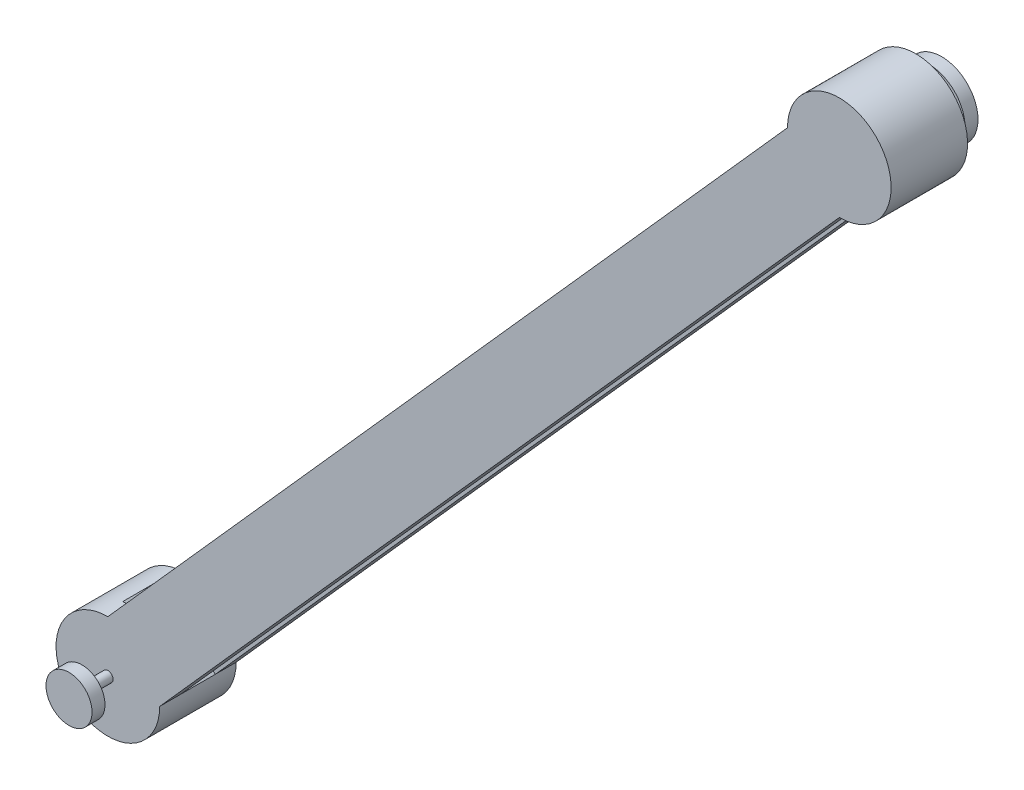
ISO-10303-21;
HEADER;
FILE_DESCRIPTION(('STEP AP214'),'2;1');
FILE_NAME('part.step','',(''),(''),'','','');
FILE_SCHEMA(('AUTOMOTIVE_DESIGN { 1 0 10303 214 1 1 1 1 }'));
ENDSEC;
DATA;
#1=APPLICATION_CONTEXT('core data for automotive mechanical design processes');
#2=APPLICATION_PROTOCOL_DEFINITION('international standard','automotive_design',2000,#1);
#3=PRODUCT_CONTEXT('',#1,'mechanical');
#4=PRODUCT('Part','Part','',(#3));
#5=PRODUCT_RELATED_PRODUCT_CATEGORY('part','',(#4));
#6=PRODUCT_DEFINITION_FORMATION('','',#4);
#7=PRODUCT_DEFINITION_CONTEXT('part definition',#1,'design');
#8=PRODUCT_DEFINITION('design','',#6,#7);
#9=PRODUCT_DEFINITION_SHAPE('','',#8);
#10=(LENGTH_UNIT() NAMED_UNIT(*) SI_UNIT(.MILLI.,.METRE.));
#11=(NAMED_UNIT(*) PLANE_ANGLE_UNIT() SI_UNIT($,.RADIAN.));
#12=(NAMED_UNIT(*) SI_UNIT($,.STERADIAN.) SOLID_ANGLE_UNIT());
#13=UNCERTAINTY_MEASURE_WITH_UNIT(LENGTH_MEASURE(1.E-05),#10,'distance_accuracy_value','');
#14=(GEOMETRIC_REPRESENTATION_CONTEXT(3) GLOBAL_UNCERTAINTY_ASSIGNED_CONTEXT((#13)) GLOBAL_UNIT_ASSIGNED_CONTEXT((#10,
#11,#12)) REPRESENTATION_CONTEXT('',''));
#15=CARTESIAN_POINT('',(0.,0.,0.));
#16=DIRECTION('',(0.,0.,1.));
#17=DIRECTION('',(1.,0.,0.));
#18=AXIS2_PLACEMENT_3D('',#15,#16,#17);
#19=CARTESIAN_POINT('',(157.094667176037,-48.9305085245538,-336.656253530233));
#20=DIRECTION('',(0.,0.,1.));
#21=DIRECTION('',(-1.,0.,0.));
#22=AXIS2_PLACEMENT_3D('',#19,#20,#21);
#23=CYLINDRICAL_SURFACE('',#22,7.12698067990463);
#24=CARTESIAN_POINT('',(157.094667176037,-48.9305085245538,-336.656253530233));
#25=DIRECTION('',(0.,0.,1.));
#26=DIRECTION('',(1.,0.,0.));
#27=AXIS2_PLACEMENT_3D('',#24,#25,#26);
#28=CIRCLE('',#27,7.12698067990463);
#29=CARTESIAN_POINT('',(164.221647855942,-48.9305085245538,-336.656253530233));
#30=VERTEX_POINT('',#29);
#31=EDGE_CURVE('E11',#30,#30,#28,.T.);
#32=ORIENTED_EDGE('',*,*,#31,.T.);
#33=EDGE_LOOP('',(#32));
#34=FACE_BOUND('',#33,.T.);
#35=CARTESIAN_POINT('',(157.094667176037,-48.9305085245538,-334.116253530233));
#36=DIRECTION('',(0.,0.,1.));
#37=DIRECTION('',(1.,0.,0.));
#38=AXIS2_PLACEMENT_3D('',#35,#36,#37);
#39=CIRCLE('',#38,7.12698067990463);
#40=CARTESIAN_POINT('',(164.221647855942,-48.9305085245538,-334.116253530233));
#41=VERTEX_POINT('',#40);
#42=EDGE_CURVE('E46',#41,#41,#39,.T.);
#43=ORIENTED_EDGE('',*,*,#42,.F.);
#44=EDGE_LOOP('',(#43));
#45=FACE_BOUND('',#44,.T.);
#46=ADVANCED_FACE('F43',(#34,#45),#23,.T.);
#47=CARTESIAN_POINT('',(157.094667176037,-48.9305085245538,-336.656253530233));
#48=DIRECTION('',(0.,0.,-1.));
#49=DIRECTION('',(1.,0.,0.));
#50=AXIS2_PLACEMENT_3D('',#47,#48,#49);
#51=PLANE('',#50);
#52=ORIENTED_EDGE('',*,*,#31,.F.);
#53=EDGE_LOOP('',(#52));
#54=FACE_BOUND('',#53,.T.);
#55=ADVANCED_FACE('F246',(#54),#51,.T.);
#56=CARTESIAN_POINT('',(157.094667176037,-48.9305085245538,-334.116253530233));
#57=DIRECTION('',(0.,0.,-1.));
#58=DIRECTION('',(1.,0.,0.));
#59=AXIS2_PLACEMENT_3D('',#56,#57,#58);
#60=PLANE('',#59);
#61=CARTESIAN_POINT('',(157.094667176037,-48.9305085245538,-334.116253530233));
#62=DIRECTION('',(0.,0.,1.));
#63=DIRECTION('',(1.,0.,0.));
#64=AXIS2_PLACEMENT_3D('',#61,#62,#63);
#65=CIRCLE('',#64,1.016);
#66=CARTESIAN_POINT('',(158.110667176037,-48.9305085245538,-334.116253530233));
#67=VERTEX_POINT('',#66);
#68=EDGE_CURVE('E412',#67,#67,#65,.T.);
#69=ORIENTED_EDGE('',*,*,#68,.F.);
#70=EDGE_LOOP('',(#69));
#71=FACE_BOUND('',#70,.T.);
#72=ORIENTED_EDGE('',*,*,#42,.T.);
#73=EDGE_LOOP('',(#72));
#74=FACE_BOUND('',#73,.T.);
#75=ADVANCED_FACE('F251',(#71,#74),#60,.F.);
#76=CARTESIAN_POINT('',(116.967044027861,-104.154446141889,-316.590253530233));
#77=DIRECTION('',(0.746826492090616,-0.66501894011496,0.));
#78=DIRECTION('',(0.66501894011496,0.746826492090616,0.));
#79=AXIS2_PLACEMENT_3D('',#76,#77,#78);
#80=PLANE('',#79);
#81=DIRECTION('',(0.66501894011496,0.746826492090616,0.));
#82=VECTOR('',#81,1.);
#83=CARTESIAN_POINT('',(157.094667176037,-59.0905085245538,-320.672765338957));
#84=LINE('',#83,#82);
#85=CARTESIAN_POINT('',(23.8515333224159,-208.724595989579,-320.672765338957));
#86=VERTEX_POINT('',#85);
#87=CARTESIAN_POINT('',(157.094667176037,-59.0905085245538,-320.672765338957));
#88=VERTEX_POINT('',#87);
#89=EDGE_CURVE('E132',#86,#88,#84,.T.);
#90=ORIENTED_EDGE('',*,*,#89,.T.);
#91=DIRECTION('',(0.,0.,-1.));
#92=VECTOR('',#91,1.);
#93=CARTESIAN_POINT('',(157.094667176037,-59.0905085245538,-316.590253530233));
#94=LINE('',#93,#92);
#95=CARTESIAN_POINT('',(157.094667176037,-59.0905085245538,-316.590253530233));
#96=VERTEX_POINT('',#95);
#97=EDGE_CURVE('E129',#96,#88,#94,.T.);
#98=ORIENTED_EDGE('',*,*,#97,.F.);
#99=DIRECTION('',(0.66501894011496,0.746826492090616,0.));
#100=VECTOR('',#99,1.);
#101=CARTESIAN_POINT('',(116.967044027861,-104.154446141889,-316.590253530233));
#102=LINE('',#101,#100);
#103=CARTESIAN_POINT('',(23.8515333224159,-208.724595989579,-316.590253530233));
#104=VERTEX_POINT('',#103);
#105=EDGE_CURVE('E174',#104,#96,#102,.T.);
#106=ORIENTED_EDGE('',*,*,#105,.F.);
#107=DIRECTION('',(0.,0.,-1.));
#108=VECTOR('',#107,1.);
#109=CARTESIAN_POINT('',(23.8515333224159,-208.724595989579,-316.590253530233));
#110=LINE('',#109,#108);
#111=EDGE_CURVE('E183',#104,#86,#110,.T.);
#112=ORIENTED_EDGE('',*,*,#111,.T.);
#113=EDGE_LOOP('',(#90,#98,#106,#112));
#114=FACE_BOUND('',#113,.T.);
#115=ADVANCED_FACE('F215',(#114),#80,.T.);
#116=DIRECTION('',(-0.66501894011496,-0.746826492090616,0.));
#117=VECTOR('',#116,1.);
#118=CARTESIAN_POINT('',(157.094667176037,-59.0905085245538,-327.493741721509));
#119=LINE('',#118,#117);
#120=CARTESIAN_POINT('',(157.094667176037,-59.0905085245538,-327.493741721509));
#121=VERTEX_POINT('',#120);
#122=CARTESIAN_POINT('',(23.8515333224159,-208.724595989579,-327.493741721509));
#123=VERTEX_POINT('',#122);
#124=EDGE_CURVE('E131',#121,#123,#119,.T.);
#125=ORIENTED_EDGE('',*,*,#124,.T.);
#126=CARTESIAN_POINT('',(23.8515333224159,-208.724595989579,-331.576253530233));
#127=VERTEX_POINT('',#126);
#128=EDGE_CURVE('E187',#123,#127,#110,.T.);
#129=ORIENTED_EDGE('',*,*,#128,.T.);
#130=DIRECTION('',(0.66501894011496,0.746826492090616,0.));
#131=VECTOR('',#130,1.);
#132=CARTESIAN_POINT('',(116.967044027861,-104.154446141889,-331.576253530233));
#133=LINE('',#132,#131);
#134=CARTESIAN_POINT('',(157.094667176037,-59.0905085245538,-331.576253530233));
#135=VERTEX_POINT('',#134);
#136=EDGE_CURVE('E139',#127,#135,#133,.T.);
#137=ORIENTED_EDGE('',*,*,#136,.T.);
#138=EDGE_CURVE('E126',#121,#135,#94,.T.);
#139=ORIENTED_EDGE('',*,*,#138,.F.);
#140=EDGE_LOOP('',(#125,#129,#137,#139));
#141=FACE_BOUND('',#140,.T.);
#142=ADVANCED_FACE('F136',(#141),#80,.T.);
#143=CARTESIAN_POINT('',(13.6915333224159,-208.724595989579,-316.590253530233));
#144=DIRECTION('',(0.,0.,-1.));
#145=DIRECTION('',(1.,0.,0.));
#146=AXIS2_PLACEMENT_3D('',#143,#144,#145);
#147=CYLINDRICAL_SURFACE('',#146,10.16);
#148=CARTESIAN_POINT('',(13.6915333224159,-208.724595989579,-320.672765338957));
#149=DIRECTION('',(0.,0.,-1.));
#150=DIRECTION('',(-1.,0.,0.));
#151=AXIS2_PLACEMENT_3D('',#148,#149,#150);
#152=CIRCLE('',#151,10.16);
#153=CARTESIAN_POINT('',(13.6915333224158,-198.564595989579,-320.672765338957));
#154=VERTEX_POINT('',#153);
#155=CARTESIAN_POINT('',(12.5180571976761,-198.632591541271,-320.672765338957));
#156=VERTEX_POINT('',#155);
#157=EDGE_CURVE('E163',#154,#156,#152,.F.);
#158=ORIENTED_EDGE('',*,*,#157,.T.);
#159=DIRECTION('',(0.,0.,-1.));
#160=VECTOR('',#159,1.);
#161=CARTESIAN_POINT('',(12.5180571976761,-198.632591541271,-316.590253530233));
#162=LINE('',#161,#160);
#163=CARTESIAN_POINT('',(12.5180571976761,-198.632591541271,-327.493741721509));
#164=VERTEX_POINT('',#163);
#165=EDGE_CURVE('E186',#156,#164,#162,.T.);
#166=ORIENTED_EDGE('',*,*,#165,.T.);
#167=CARTESIAN_POINT('',(13.6915333224159,-208.724595989579,-327.493741721509));
#168=DIRECTION('',(0.,0.,1.));
#169=DIRECTION('',(1.,0.,0.));
#170=AXIS2_PLACEMENT_3D('',#167,#168,#169);
#171=CIRCLE('',#170,10.16);
#172=CARTESIAN_POINT('',(13.6915333224158,-198.564595989579,-327.493741721509));
#173=VERTEX_POINT('',#172);
#174=EDGE_CURVE('E158',#164,#173,#171,.F.);
#175=ORIENTED_EDGE('',*,*,#174,.T.);
#176=DIRECTION('',(0.,0.,-1.));
#177=VECTOR('',#176,1.);
#178=CARTESIAN_POINT('',(13.6915333224159,-198.564595989579,-316.590253530233));
#179=LINE('',#178,#177);
#180=CARTESIAN_POINT('',(13.6915333224159,-198.564595989579,-331.576253530233));
#181=VERTEX_POINT('',#180);
#182=EDGE_CURVE('E191',#173,#181,#179,.T.);
#183=ORIENTED_EDGE('',*,*,#182,.T.);
#184=CARTESIAN_POINT('',(13.6915333224159,-208.724595989579,-331.576253530233));
#185=DIRECTION('',(0.,0.,1.));
#186=DIRECTION('',(1.,0.,0.));
#187=AXIS2_PLACEMENT_3D('',#184,#185,#186);
#188=CIRCLE('',#187,10.16);
#189=EDGE_CURVE('E172',#181,#127,#188,.T.);
#190=ORIENTED_EDGE('',*,*,#189,.T.);
#191=ORIENTED_EDGE('',*,*,#128,.F.);
#192=DIRECTION('',(0.,0.,1.));
#193=VECTOR('',#192,1.);
#194=CARTESIAN_POINT('',(23.8515333224159,-208.724595989579,-327.493741721509));
#195=LINE('',#194,#193);
#196=EDGE_CURVE('E145',#123,#86,#195,.T.);
#197=ORIENTED_EDGE('',*,*,#196,.T.);
#198=ORIENTED_EDGE('',*,*,#111,.F.);
#199=CARTESIAN_POINT('',(13.6915333224159,-208.724595989579,-316.590253530233));
#200=DIRECTION('',(0.,0.,1.));
#201=DIRECTION('',(1.,0.,0.));
#202=AXIS2_PLACEMENT_3D('',#199,#200,#201);
#203=CIRCLE('',#202,10.16);
#204=CARTESIAN_POINT('',(13.6915333224159,-198.564595989579,-316.590253530233));
#205=VERTEX_POINT('',#204);
#206=EDGE_CURVE('E140',#205,#104,#203,.T.);
#207=ORIENTED_EDGE('',*,*,#206,.F.);
#208=EDGE_CURVE('E188',#205,#154,#179,.T.);
#209=ORIENTED_EDGE('',*,*,#208,.T.);
#210=EDGE_LOOP('',(#158,#166,#175,#183,#190,#191,#197,#198,#207,#209));
#211=FACE_BOUND('',#210,.T.);
#212=ADVANCED_FACE('F222',(#211),#147,.T.);
#213=CARTESIAN_POINT('',(106.254303741337,-94.6151819801046,-316.590253530233));
#214=DIRECTION('',(0.746826492090616,-0.66501894011496,0.));
#215=DIRECTION('',(0.66501894011496,0.746826492090616,0.));
#216=AXIS2_PLACEMENT_3D('',#213,#214,#215);
#217=PLANE('',#216);
#218=ORIENTED_EDGE('',*,*,#208,.F.);
#219=DIRECTION('',(0.66501894011496,0.746826492090616,0.));
#220=VECTOR('',#219,1.);
#221=CARTESIAN_POINT('',(106.254303741337,-94.6151819801046,-316.590253530233));
#222=LINE('',#221,#220);
#223=CARTESIAN_POINT('',(146.934667176037,-48.9305085245538,-316.590253530233));
#224=VERTEX_POINT('',#223);
#225=EDGE_CURVE('E179',#205,#224,#222,.T.);
#226=ORIENTED_EDGE('',*,*,#225,.T.);
#227=DIRECTION('',(0.,0.,-1.));
#228=VECTOR('',#227,1.);
#229=CARTESIAN_POINT('',(146.934667176037,-48.9305085245538,-316.590253530233));
#230=LINE('',#229,#228);
#231=CARTESIAN_POINT('',(146.934667176037,-48.9305085245538,-331.576253530233));
#232=VERTEX_POINT('',#231);
#233=EDGE_CURVE('E192',#224,#232,#230,.T.);
#234=ORIENTED_EDGE('',*,*,#233,.T.);
#235=DIRECTION('',(0.66501894011496,0.746826492090616,0.));
#236=VECTOR('',#235,1.);
#237=CARTESIAN_POINT('',(106.254303741337,-94.6151819801046,-331.576253530233));
#238=LINE('',#237,#236);
#239=EDGE_CURVE('E169',#181,#232,#238,.T.);
#240=ORIENTED_EDGE('',*,*,#239,.F.);
#241=ORIENTED_EDGE('',*,*,#182,.F.);
#242=DIRECTION('',(-0.66501894011496,-0.746826492090616,0.));
#243=VECTOR('',#242,1.);
#244=CARTESIAN_POINT('',(106.254303741337,-94.6151819801046,-327.493741721509));
#245=LINE('',#244,#243);
#246=CARTESIAN_POINT('',(146.381926889513,-49.5512443627698,-327.493741721509));
#247=VERTEX_POINT('',#246);
#248=EDGE_CURVE('E156',#247,#173,#245,.T.);
#249=ORIENTED_EDGE('',*,*,#248,.F.);
#250=DIRECTION('',(0.,0.,-1.));
#251=VECTOR('',#250,1.);
#252=CARTESIAN_POINT('',(146.381926889513,-49.5512443627698,-316.590253530233));
#253=LINE('',#252,#251);
#254=CARTESIAN_POINT('',(146.381926889513,-49.5512443627698,-320.672765338957));
#255=VERTEX_POINT('',#254);
#256=EDGE_CURVE('E117',#255,#247,#253,.T.);
#257=ORIENTED_EDGE('',*,*,#256,.F.);
#258=DIRECTION('',(0.66501894011496,0.746826492090616,0.));
#259=VECTOR('',#258,1.);
#260=CARTESIAN_POINT('',(106.254303741337,-94.6151819801046,-320.672765338957));
#261=LINE('',#260,#259);
#262=EDGE_CURVE('E161',#154,#255,#261,.T.);
#263=ORIENTED_EDGE('',*,*,#262,.F.);
#264=EDGE_LOOP('',(#218,#226,#234,#240,#241,#249,#257,#263));
#265=FACE_BOUND('',#264,.T.);
#266=ADVANCED_FACE('F226',(#265),#217,.F.);
#267=CARTESIAN_POINT('',(157.094667176037,-48.9305085245538,-316.590253530233));
#268=DIRECTION('',(0.,0.,-1.));
#269=DIRECTION('',(1.,0.,0.));
#270=AXIS2_PLACEMENT_3D('',#267,#268,#269);
#271=CYLINDRICAL_SURFACE('',#270,10.16);
#272=ORIENTED_EDGE('',*,*,#233,.F.);
#273=CARTESIAN_POINT('',(157.094667176037,-48.9305085245538,-316.590253530233));
#274=DIRECTION('',(0.,0.,1.));
#275=DIRECTION('',(1.,0.,0.));
#276=AXIS2_PLACEMENT_3D('',#273,#274,#275);
#277=CIRCLE('',#276,10.16);
#278=EDGE_CURVE('E177',#96,#224,#277,.T.);
#279=ORIENTED_EDGE('',*,*,#278,.F.);
#280=ORIENTED_EDGE('',*,*,#97,.T.);
#281=DIRECTION('',(0.,0.,-1.));
#282=VECTOR('',#281,1.);
#283=CARTESIAN_POINT('',(157.094667176037,-59.0905085245538,-327.493741721509));
#284=LINE('',#283,#282);
#285=EDGE_CURVE('E114',#88,#121,#284,.T.);
#286=ORIENTED_EDGE('',*,*,#285,.T.);
#287=ORIENTED_EDGE('',*,*,#138,.T.);
#288=CARTESIAN_POINT('',(157.094667176037,-48.9305085245538,-331.576253530233));
#289=DIRECTION('',(0.,0.,1.));
#290=DIRECTION('',(1.,0.,0.));
#291=AXIS2_PLACEMENT_3D('',#288,#289,#290);
#292=CIRCLE('',#291,10.16);
#293=EDGE_CURVE('E167',#135,#232,#292,.T.);
#294=ORIENTED_EDGE('',*,*,#293,.T.);
#295=EDGE_LOOP('',(#272,#279,#280,#286,#287,#294));
#296=FACE_BOUND('',#295,.T.);
#297=ADVANCED_FACE('F125',(#296),#271,.T.);
#298=CARTESIAN_POINT('',(0.,0.,-316.590253530233));
#299=DIRECTION('',(0.,0.,-1.));
#300=DIRECTION('',(1.,0.,0.));
#301=AXIS2_PLACEMENT_3D('',#298,#299,#300);
#302=PLANE('',#301);
#303=CARTESIAN_POINT('',(13.6915333224159,-208.724595989579,-316.590253530233));
#304=DIRECTION('',(0.,0.,-1.));
#305=DIRECTION('',(-1.,0.,0.));
#306=AXIS2_PLACEMENT_3D('',#303,#304,#305);
#307=CIRCLE('',#306,1.01600000000001);
#308=CARTESIAN_POINT('',(12.6755333224159,-208.724595989579,-316.590253530233));
#309=VERTEX_POINT('',#308);
#310=EDGE_CURVE('E196',#309,#309,#307,.T.);
#311=ORIENTED_EDGE('',*,*,#310,.T.);
#312=EDGE_LOOP('',(#311));
#313=FACE_BOUND('',#312,.T.);
#314=ORIENTED_EDGE('',*,*,#105,.T.);
#315=ORIENTED_EDGE('',*,*,#278,.T.);
#316=ORIENTED_EDGE('',*,*,#225,.F.);
#317=ORIENTED_EDGE('',*,*,#206,.T.);
#318=EDGE_LOOP('',(#314,#315,#316,#317));
#319=FACE_BOUND('',#318,.T.);
#320=ADVANCED_FACE('F234',(#313,#319),#302,.F.);
#321=CARTESIAN_POINT('',(0.,0.,-331.576253530233));
#322=DIRECTION('',(0.,0.,-1.));
#323=DIRECTION('',(1.,0.,0.));
#324=AXIS2_PLACEMENT_3D('',#321,#322,#323);
#325=PLANE('',#324);
#326=CARTESIAN_POINT('',(157.094667176037,-48.9305085245538,-331.576253530233));
#327=DIRECTION('',(0.,0.,1.));
#328=DIRECTION('',(1.,0.,0.));
#329=AXIS2_PLACEMENT_3D('',#326,#327,#328);
#330=CIRCLE('',#329,1.016);
#331=CARTESIAN_POINT('',(158.110667176037,-48.9305085245538,-331.576253530233));
#332=VERTEX_POINT('',#331);
#333=EDGE_CURVE('E200',#332,#332,#330,.T.);
#334=ORIENTED_EDGE('',*,*,#333,.T.);
#335=EDGE_LOOP('',(#334));
#336=FACE_BOUND('',#335,.T.);
#337=ORIENTED_EDGE('',*,*,#136,.F.);
#338=ORIENTED_EDGE('',*,*,#189,.F.);
#339=ORIENTED_EDGE('',*,*,#239,.T.);
#340=ORIENTED_EDGE('',*,*,#293,.F.);
#341=EDGE_LOOP('',(#337,#338,#339,#340));
#342=FACE_BOUND('',#341,.T.);
#343=ADVANCED_FACE('F232',(#336,#342),#325,.T.);
#344=CARTESIAN_POINT('',(137.081957667485,-41.2699959862932,-327.493741721509));
#345=DIRECTION('',(0.66501894011496,0.746826492090616,0.));
#346=DIRECTION('',(-0.746826492090616,0.66501894011496,0.));
#347=AXIS2_PLACEMENT_3D('',#344,#345,#346);
#348=PLANE('',#347);
#349=DIRECTION('',(0.746826492090616,-0.66501894011496,0.));
#350=VECTOR('',#349,1.);
#351=CARTESIAN_POINT('',(137.081957667485,-41.2699959862932,-320.672765338957));
#352=LINE('',#351,#350);
#353=EDGE_CURVE('E65',#255,#88,#352,.T.);
#354=ORIENTED_EDGE('',*,*,#353,.F.);
#355=ORIENTED_EDGE('',*,*,#256,.T.);
#356=DIRECTION('',(0.746826492090616,-0.66501894011496,0.));
#357=VECTOR('',#356,1.);
#358=CARTESIAN_POINT('',(137.081957667485,-41.2699959862932,-327.493741721509));
#359=LINE('',#358,#357);
#360=EDGE_CURVE('E57',#247,#121,#359,.T.);
#361=ORIENTED_EDGE('',*,*,#360,.T.);
#362=ORIENTED_EDGE('',*,*,#285,.F.);
#363=EDGE_LOOP('',(#354,#355,#361,#362));
#364=FACE_BOUND('',#363,.T.);
#365=ADVANCED_FACE('F113',(#364),#348,.F.);
#366=CARTESIAN_POINT('',(137.081957667485,-41.2699959862932,-320.672765338957));
#367=DIRECTION('',(0.,0.,1.));
#368=DIRECTION('',(-1.,0.,0.));
#369=AXIS2_PLACEMENT_3D('',#366,#367,#368);
#370=PLANE('',#369);
#371=ORIENTED_EDGE('',*,*,#157,.F.);
#372=ORIENTED_EDGE('',*,*,#262,.T.);
#373=ORIENTED_EDGE('',*,*,#353,.T.);
#374=ORIENTED_EDGE('',*,*,#89,.F.);
#375=DIRECTION('',(0.746826492090616,-0.66501894011496,0.));
#376=VECTOR('',#375,1.);
#377=CARTESIAN_POINT('',(3.83882381386363,-190.904083451318,-320.672765338957));
#378=LINE('',#377,#376);
#379=EDGE_CURVE('E151',#156,#86,#378,.T.);
#380=ORIENTED_EDGE('',*,*,#379,.F.);
#381=EDGE_LOOP('',(#371,#372,#373,#374,#380));
#382=FACE_BOUND('',#381,.T.);
#383=ADVANCED_FACE('F219',(#382),#370,.F.);
#384=CARTESIAN_POINT('',(3.83882381386363,-190.904083451318,-327.493741721509));
#385=DIRECTION('',(-0.66501894011496,-0.746826492090616,0.));
#386=DIRECTION('',(0.746826492090616,-0.66501894011496,0.));
#387=AXIS2_PLACEMENT_3D('',#384,#385,#386);
#388=PLANE('',#387);
#389=ORIENTED_EDGE('',*,*,#165,.F.);
#390=ORIENTED_EDGE('',*,*,#379,.T.);
#391=ORIENTED_EDGE('',*,*,#196,.F.);
#392=DIRECTION('',(0.746826492090616,-0.66501894011496,0.));
#393=VECTOR('',#392,1.);
#394=CARTESIAN_POINT('',(3.83882381386363,-190.904083451318,-327.493741721509));
#395=LINE('',#394,#393);
#396=EDGE_CURVE('E119',#164,#123,#395,.T.);
#397=ORIENTED_EDGE('',*,*,#396,.F.);
#398=EDGE_LOOP('',(#389,#390,#391,#397));
#399=FACE_BOUND('',#398,.T.);
#400=ADVANCED_FACE('F221',(#399),#388,.F.);
#401=CARTESIAN_POINT('',(137.081957667485,-41.2699959862932,-327.493741721509));
#402=DIRECTION('',(0.,0.,-1.));
#403=DIRECTION('',(1.,0.,0.));
#404=AXIS2_PLACEMENT_3D('',#401,#402,#403);
#405=PLANE('',#404);
#406=ORIENTED_EDGE('',*,*,#174,.F.);
#407=ORIENTED_EDGE('',*,*,#396,.T.);
#408=ORIENTED_EDGE('',*,*,#124,.F.);
#409=ORIENTED_EDGE('',*,*,#360,.F.);
#410=ORIENTED_EDGE('',*,*,#248,.T.);
#411=EDGE_LOOP('',(#406,#407,#408,#409,#410));
#412=FACE_BOUND('',#411,.T.);
#413=ADVANCED_FACE('F143',(#412),#405,.F.);
#414=CARTESIAN_POINT('',(13.6915333224159,-208.724595989579,-308.970253530233));
#415=DIRECTION('',(0.,0.,-1.));
#416=DIRECTION('',(1.,0.,0.));
#417=AXIS2_PLACEMENT_3D('',#414,#415,#416);
#418=CYLINDRICAL_SURFACE('',#417,4.51392574953432);
#419=CARTESIAN_POINT('',(13.6915333224159,-208.724595989579,-308.970253530233));
#420=DIRECTION('',(0.,0.,-1.));
#421=DIRECTION('',(-1.,0.,0.));
#422=AXIS2_PLACEMENT_3D('',#419,#420,#421);
#423=CIRCLE('',#422,4.51392574953432);
#424=CARTESIAN_POINT('',(9.17760757288155,-208.724595989579,-308.970253530233));
#425=VERTEX_POINT('',#424);
#426=EDGE_CURVE('E209',#425,#425,#423,.T.);
#427=ORIENTED_EDGE('',*,*,#426,.T.);
#428=EDGE_LOOP('',(#427));
#429=FACE_BOUND('',#428,.T.);
#430=CARTESIAN_POINT('',(13.6915333224159,-208.724595989579,-311.510253530233));
#431=DIRECTION('',(0.,0.,-1.));
#432=DIRECTION('',(-1.,0.,0.));
#433=AXIS2_PLACEMENT_3D('',#430,#431,#432);
#434=CIRCLE('',#433,4.51392574953432);
#435=CARTESIAN_POINT('',(9.17760757288155,-208.724595989579,-311.510253530233));
#436=VERTEX_POINT('',#435);
#437=EDGE_CURVE('E212',#436,#436,#434,.T.);
#438=ORIENTED_EDGE('',*,*,#437,.F.);
#439=EDGE_LOOP('',(#438));
#440=FACE_BOUND('',#439,.T.);
#441=ADVANCED_FACE('F365',(#429,#440),#418,.T.);
#442=CARTESIAN_POINT('',(13.6915333224159,-208.724595989579,-308.970253530233));
#443=DIRECTION('',(0.,0.,1.));
#444=DIRECTION('',(-1.,0.,0.));
#445=AXIS2_PLACEMENT_3D('',#442,#443,#444);
#446=PLANE('',#445);
#447=ORIENTED_EDGE('',*,*,#426,.F.);
#448=EDGE_LOOP('',(#447));
#449=FACE_BOUND('',#448,.T.);
#450=ADVANCED_FACE('F356',(#449),#446,.T.);
#451=CARTESIAN_POINT('',(13.6915333224159,-208.724595989579,-311.510253530233));
#452=DIRECTION('',(0.,0.,1.));
#453=DIRECTION('',(-1.,0.,0.));
#454=AXIS2_PLACEMENT_3D('',#451,#452,#453);
#455=PLANE('',#454);
#456=CARTESIAN_POINT('',(13.6915333224159,-208.724595989579,-311.510253530233));
#457=DIRECTION('',(0.,0.,-1.));
#458=DIRECTION('',(-1.,0.,0.));
#459=AXIS2_PLACEMENT_3D('',#456,#457,#458);
#460=CIRCLE('',#459,1.01600000000001);
#461=CARTESIAN_POINT('',(12.6755333224159,-208.724595989579,-311.510253530233));
#462=VERTEX_POINT('',#461);
#463=EDGE_CURVE('E208',#462,#462,#460,.T.);
#464=ORIENTED_EDGE('',*,*,#463,.F.);
#465=EDGE_LOOP('',(#464));
#466=FACE_BOUND('',#465,.T.);
#467=ORIENTED_EDGE('',*,*,#437,.T.);
#468=EDGE_LOOP('',(#467));
#469=FACE_BOUND('',#468,.T.);
#470=ADVANCED_FACE('F347',(#466,#469),#455,.F.);
#471=CARTESIAN_POINT('',(13.6915333224159,-208.724595989579,-311.510253530233));
#472=DIRECTION('',(0.,0.,-1.));
#473=DIRECTION('',(1.,0.,0.));
#474=AXIS2_PLACEMENT_3D('',#471,#472,#473);
#475=CYLINDRICAL_SURFACE('',#474,1.01600000000001);
#476=ORIENTED_EDGE('',*,*,#463,.T.);
#477=EDGE_LOOP('',(#476));
#478=FACE_BOUND('',#477,.T.);
#479=ORIENTED_EDGE('',*,*,#310,.F.);
#480=EDGE_LOOP('',(#479));
#481=FACE_BOUND('',#480,.T.);
#482=ADVANCED_FACE('F338',(#478,#481),#475,.T.);
#483=CARTESIAN_POINT('',(157.094667176037,-48.9305085245538,-334.116253530233));
#484=DIRECTION('',(0.,0.,1.));
#485=DIRECTION('',(-1.,0.,0.));
#486=AXIS2_PLACEMENT_3D('',#483,#484,#485);
#487=CYLINDRICAL_SURFACE('',#486,1.016);
#488=ORIENTED_EDGE('',*,*,#68,.T.);
#489=EDGE_LOOP('',(#488));
#490=FACE_BOUND('',#489,.T.);
#491=ORIENTED_EDGE('',*,*,#333,.F.);
#492=EDGE_LOOP('',(#491));
#493=FACE_BOUND('',#492,.T.);
#494=ADVANCED_FACE('F334',(#490,#493),#487,.T.);
#495=CLOSED_SHELL('',(#46,#55,#75,#115,#142,#212,#266,#297,#320,#343,#365,#383,#400,#413,#441,
#450,#470,#482,#494));
#496=MANIFOLD_SOLID_BREP('B2',#495);
#497=ADVANCED_BREP_SHAPE_REPRESENTATION('',(#18,#496),#14);
#498=SHAPE_DEFINITION_REPRESENTATION(#9,#497);
ENDSEC;
END-ISO-10303-21;
